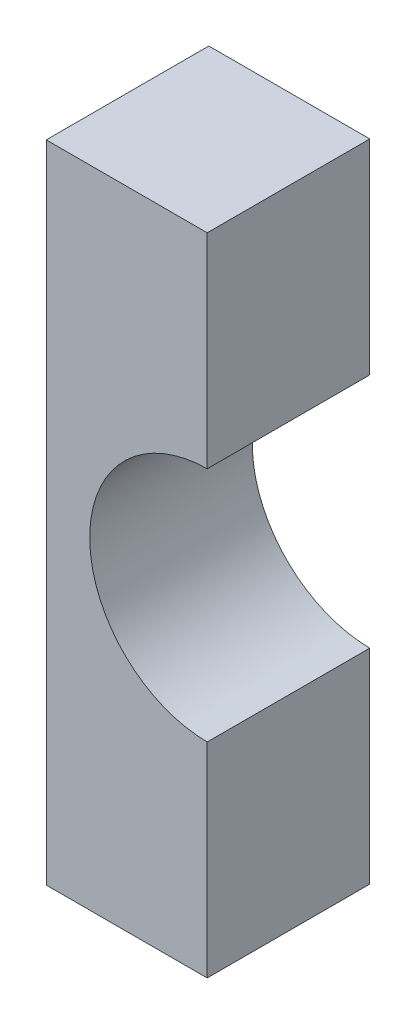
ISO-10303-21;
HEADER;
FILE_DESCRIPTION(('STEP AP214'),'2;1');
FILE_NAME('part.step','',(''),(''),'','','');
FILE_SCHEMA(('AUTOMOTIVE_DESIGN { 1 0 10303 214 1 1 1 1 }'));
ENDSEC;
DATA;
#1=APPLICATION_CONTEXT('core data for automotive mechanical design processes');
#2=APPLICATION_PROTOCOL_DEFINITION('international standard','automotive_design',2000,#1);
#3=PRODUCT_CONTEXT('',#1,'mechanical');
#4=PRODUCT('Part','Part','',(#3));
#5=PRODUCT_RELATED_PRODUCT_CATEGORY('part','',(#4));
#6=PRODUCT_DEFINITION_FORMATION('','',#4);
#7=PRODUCT_DEFINITION_CONTEXT('part definition',#1,'design');
#8=PRODUCT_DEFINITION('design','',#6,#7);
#9=PRODUCT_DEFINITION_SHAPE('','',#8);
#10=(LENGTH_UNIT() NAMED_UNIT(*) SI_UNIT(.MILLI.,.METRE.));
#11=(NAMED_UNIT(*) PLANE_ANGLE_UNIT() SI_UNIT($,.RADIAN.));
#12=(NAMED_UNIT(*) SI_UNIT($,.STERADIAN.) SOLID_ANGLE_UNIT());
#13=UNCERTAINTY_MEASURE_WITH_UNIT(LENGTH_MEASURE(1.E-05),#10,'distance_accuracy_value','');
#14=(GEOMETRIC_REPRESENTATION_CONTEXT(3) GLOBAL_UNCERTAINTY_ASSIGNED_CONTEXT((#13)) GLOBAL_UNIT_ASSIGNED_CONTEXT((#10,
#11,#12)) REPRESENTATION_CONTEXT('',''));
#15=CARTESIAN_POINT('',(0.,0.,0.));
#16=DIRECTION('',(0.,0.,1.));
#17=DIRECTION('',(1.,0.,0.));
#18=AXIS2_PLACEMENT_3D('',#15,#16,#17);
#19=CARTESIAN_POINT('',(0.799,0.401,0.201));
#20=DIRECTION('',(1.,0.,0.));
#21=DIRECTION('',(0.,0.,-1.));
#22=AXIS2_PLACEMENT_3D('',#19,#20,#21);
#23=PLANE('',#22);
#24=DIRECTION('',(0.,0.,-1.));
#25=VECTOR('',#24,1.);
#26=CARTESIAN_POINT('',(0.798999999999999,0.146996598600104,0.201));
#27=LINE('',#26,#25);
#28=CARTESIAN_POINT('',(0.799,0.146996598600104,0.201));
#29=VERTEX_POINT('',#28);
#30=CARTESIAN_POINT('',(0.799,0.146996598600104,-0.000999999999999997));
#31=VERTEX_POINT('',#30);
#32=EDGE_CURVE('E77',#29,#31,#27,.T.);
#33=ORIENTED_EDGE('',*,*,#32,.T.);
#34=DIRECTION('',(0.,1.,0.));
#35=VECTOR('',#34,1.);
#36=CARTESIAN_POINT('',(0.799,0.,-0.001));
#37=LINE('',#36,#35);
#38=CARTESIAN_POINT('',(0.799,0.401,-0.000999999999999999));
#39=VERTEX_POINT('',#38);
#40=EDGE_CURVE('E94',#39,#31,#37,.F.);
#41=ORIENTED_EDGE('',*,*,#40,.F.);
#42=DIRECTION('',(0.,0.,1.));
#43=VECTOR('',#42,1.);
#44=CARTESIAN_POINT('',(0.799,0.401,0.201));
#45=LINE('',#44,#43);
#46=CARTESIAN_POINT('',(0.799,0.401,0.201));
#47=VERTEX_POINT('',#46);
#48=EDGE_CURVE('E79',#47,#39,#45,.F.);
#49=ORIENTED_EDGE('',*,*,#48,.F.);
#50=DIRECTION('',(0.,1.,0.));
#51=VECTOR('',#50,1.);
#52=CARTESIAN_POINT('',(0.799,0.,0.201));
#53=LINE('',#52,#51);
#54=EDGE_CURVE('E70',#47,#29,#53,.F.);
#55=ORIENTED_EDGE('',*,*,#54,.T.);
#56=EDGE_LOOP('',(#33,#41,#49,#55));
#57=FACE_BOUND('',#56,.T.);
#58=ADVANCED_FACE('F17',(#57),#23,.T.);
#59=CARTESIAN_POINT('',(0.8,0.,0.201));
#60=DIRECTION('',(0.,0.,-1.));
#61=DIRECTION('',(-1.,0.,0.));
#62=AXIS2_PLACEMENT_3D('',#59,#60,#61);
#63=CYLINDRICAL_SURFACE('',#62,0.147);
#64=ORIENTED_EDGE('',*,*,#32,.F.);
#65=CARTESIAN_POINT('',(0.8,0.,0.201));
#66=DIRECTION('',(0.,0.,-1.));
#67=DIRECTION('',(-1.,0.,0.));
#68=AXIS2_PLACEMENT_3D('',#65,#66,#67);
#69=CIRCLE('',#68,0.147);
#70=CARTESIAN_POINT('',(0.799,-0.146996598600052,0.201));
#71=VERTEX_POINT('',#70);
#72=EDGE_CURVE('E20',#29,#71,#69,.F.);
#73=ORIENTED_EDGE('',*,*,#72,.T.);
#74=DIRECTION('',(0.,0.,-1.));
#75=VECTOR('',#74,1.);
#76=CARTESIAN_POINT('',(0.799,-0.1469965986,0.201));
#77=LINE('',#76,#75);
#78=CARTESIAN_POINT('',(0.799,-0.146996598600052,-0.000999999999999998));
#79=VERTEX_POINT('',#78);
#80=EDGE_CURVE('E86',#79,#71,#77,.F.);
#81=ORIENTED_EDGE('',*,*,#80,.F.);
#82=CARTESIAN_POINT('',(0.8,0.,-0.000999999999999997));
#83=DIRECTION('',(0.,0.,-1.));
#84=DIRECTION('',(-1.,0.,0.));
#85=AXIS2_PLACEMENT_3D('',#82,#83,#84);
#86=CIRCLE('',#85,0.147);
#87=EDGE_CURVE('E85',#31,#79,#86,.F.);
#88=ORIENTED_EDGE('',*,*,#87,.F.);
#89=EDGE_LOOP('',(#64,#73,#81,#88));
#90=FACE_BOUND('',#89,.T.);
#91=ADVANCED_FACE('F83',(#90),#63,.F.);
#92=CARTESIAN_POINT('',(0.799,-0.1469965986,0.201));
#93=DIRECTION('',(1.,0.,0.));
#94=DIRECTION('',(0.,0.,-1.));
#95=AXIS2_PLACEMENT_3D('',#92,#93,#94);
#96=PLANE('',#95);
#97=DIRECTION('',(0.,0.,-1.));
#98=VECTOR('',#97,1.);
#99=CARTESIAN_POINT('',(0.799,-0.401,0.201));
#100=LINE('',#99,#98);
#101=CARTESIAN_POINT('',(0.799,-0.401,-0.000999999999999999));
#102=VERTEX_POINT('',#101);
#103=CARTESIAN_POINT('',(0.799,-0.401,0.201));
#104=VERTEX_POINT('',#103);
#105=EDGE_CURVE('E81',#102,#104,#100,.F.);
#106=ORIENTED_EDGE('',*,*,#105,.F.);
#107=DIRECTION('',(0.,1.,0.));
#108=VECTOR('',#107,1.);
#109=CARTESIAN_POINT('',(0.799,0.,-0.001));
#110=LINE('',#109,#108);
#111=EDGE_CURVE('E120',#79,#102,#110,.F.);
#112=ORIENTED_EDGE('',*,*,#111,.F.);
#113=ORIENTED_EDGE('',*,*,#80,.T.);
#114=DIRECTION('',(0.,1.,0.));
#115=VECTOR('',#114,1.);
#116=CARTESIAN_POINT('',(0.799,0.,0.201));
#117=LINE('',#116,#115);
#118=EDGE_CURVE('E73',#71,#104,#117,.F.);
#119=ORIENTED_EDGE('',*,*,#118,.T.);
#120=EDGE_LOOP('',(#106,#112,#113,#119));
#121=FACE_BOUND('',#120,.T.);
#122=ADVANCED_FACE('F152',(#121),#96,.T.);
#123=CARTESIAN_POINT('',(0.799,-0.401,0.201));
#124=DIRECTION('',(0.,-1.,0.));
#125=DIRECTION('',(0.,0.,-1.));
#126=AXIS2_PLACEMENT_3D('',#123,#124,#125);
#127=PLANE('',#126);
#128=DIRECTION('',(0.,0.,1.));
#129=VECTOR('',#128,1.);
#130=CARTESIAN_POINT('',(0.599,-0.401,0.201));
#131=LINE('',#130,#129);
#132=CARTESIAN_POINT('',(0.599,-0.401,-0.000999999999999998));
#133=VERTEX_POINT('',#132);
#134=CARTESIAN_POINT('',(0.599,-0.401,0.201));
#135=VERTEX_POINT('',#134);
#136=EDGE_CURVE('E114',#133,#135,#131,.T.);
#137=ORIENTED_EDGE('',*,*,#136,.F.);
#138=DIRECTION('',(-1.,0.,0.));
#139=VECTOR('',#138,1.);
#140=CARTESIAN_POINT('',(0.8,-0.401,-0.001));
#141=LINE('',#140,#139);
#142=EDGE_CURVE('E123',#102,#133,#141,.T.);
#143=ORIENTED_EDGE('',*,*,#142,.F.);
#144=ORIENTED_EDGE('',*,*,#105,.T.);
#145=DIRECTION('',(-1.,0.,0.));
#146=VECTOR('',#145,1.);
#147=CARTESIAN_POINT('',(0.8,-0.401,0.201));
#148=LINE('',#147,#146);
#149=EDGE_CURVE('E109',#104,#135,#148,.T.);
#150=ORIENTED_EDGE('',*,*,#149,.T.);
#151=EDGE_LOOP('',(#137,#143,#144,#150));
#152=FACE_BOUND('',#151,.T.);
#153=ADVANCED_FACE('F143',(#152),#127,.T.);
#154=CARTESIAN_POINT('',(0.8,0.,0.201));
#155=DIRECTION('',(0.,0.,-1.));
#156=DIRECTION('',(-1.,0.,0.));
#157=AXIS2_PLACEMENT_3D('',#154,#155,#156);
#158=PLANE('',#157);
#159=ORIENTED_EDGE('',*,*,#118,.F.);
#160=ORIENTED_EDGE('',*,*,#72,.F.);
#161=ORIENTED_EDGE('',*,*,#54,.F.);
#162=DIRECTION('',(1.,0.,0.));
#163=VECTOR('',#162,1.);
#164=CARTESIAN_POINT('',(0.599,0.401,0.201));
#165=LINE('',#164,#163);
#166=CARTESIAN_POINT('',(0.599,0.401,0.201));
#167=VERTEX_POINT('',#166);
#168=EDGE_CURVE('E98',#167,#47,#165,.T.);
#169=ORIENTED_EDGE('',*,*,#168,.F.);
#170=DIRECTION('',(0.,1.,0.));
#171=VECTOR('',#170,1.);
#172=CARTESIAN_POINT('',(0.599,-0.401,0.201));
#173=LINE('',#172,#171);
#174=EDGE_CURVE('E105',#135,#167,#173,.T.);
#175=ORIENTED_EDGE('',*,*,#174,.F.);
#176=ORIENTED_EDGE('',*,*,#149,.F.);
#177=EDGE_LOOP('',(#159,#160,#161,#169,#175,#176));
#178=FACE_BOUND('',#177,.T.);
#179=ADVANCED_FACE('F69',(#178),#158,.F.);
#180=CARTESIAN_POINT('',(0.599,0.401,0.201));
#181=DIRECTION('',(0.,1.,0.));
#182=DIRECTION('',(0.,0.,1.));
#183=AXIS2_PLACEMENT_3D('',#180,#181,#182);
#184=PLANE('',#183);
#185=ORIENTED_EDGE('',*,*,#48,.T.);
#186=DIRECTION('',(-1.,0.,0.));
#187=VECTOR('',#186,1.);
#188=CARTESIAN_POINT('',(0.8,0.401,-0.001));
#189=LINE('',#188,#187);
#190=CARTESIAN_POINT('',(0.599,0.401,-0.001));
#191=VERTEX_POINT('',#190);
#192=EDGE_CURVE('E35',#191,#39,#189,.F.);
#193=ORIENTED_EDGE('',*,*,#192,.F.);
#194=DIRECTION('',(0.,0.,1.));
#195=VECTOR('',#194,1.);
#196=CARTESIAN_POINT('',(0.599,0.401,0.201));
#197=LINE('',#196,#195);
#198=EDGE_CURVE('E26',#167,#191,#197,.F.);
#199=ORIENTED_EDGE('',*,*,#198,.F.);
#200=ORIENTED_EDGE('',*,*,#168,.T.);
#201=EDGE_LOOP('',(#185,#193,#199,#200));
#202=FACE_BOUND('',#201,.T.);
#203=ADVANCED_FACE('F166',(#202),#184,.T.);
#204=CARTESIAN_POINT('',(0.8,0.,-0.001));
#205=DIRECTION('',(0.,0.,-1.));
#206=DIRECTION('',(-1.,0.,0.));
#207=AXIS2_PLACEMENT_3D('',#204,#205,#206);
#208=PLANE('',#207);
#209=ORIENTED_EDGE('',*,*,#142,.T.);
#210=DIRECTION('',(0.,1.,0.));
#211=VECTOR('',#210,1.);
#212=CARTESIAN_POINT('',(0.599,-0.401,-0.000999999999999997));
#213=LINE('',#212,#211);
#214=EDGE_CURVE('E11',#191,#133,#213,.F.);
#215=ORIENTED_EDGE('',*,*,#214,.F.);
#216=ORIENTED_EDGE('',*,*,#192,.T.);
#217=ORIENTED_EDGE('',*,*,#40,.T.);
#218=ORIENTED_EDGE('',*,*,#87,.T.);
#219=ORIENTED_EDGE('',*,*,#111,.T.);
#220=EDGE_LOOP('',(#209,#215,#216,#217,#218,#219));
#221=FACE_BOUND('',#220,.T.);
#222=ADVANCED_FACE('F151',(#221),#208,.T.);
#223=CARTESIAN_POINT('',(0.599,-0.401,0.201));
#224=DIRECTION('',(-1.,0.,0.));
#225=DIRECTION('',(0.,0.,1.));
#226=AXIS2_PLACEMENT_3D('',#223,#224,#225);
#227=PLANE('',#226);
#228=ORIENTED_EDGE('',*,*,#198,.T.);
#229=ORIENTED_EDGE('',*,*,#214,.T.);
#230=ORIENTED_EDGE('',*,*,#136,.T.);
#231=ORIENTED_EDGE('',*,*,#174,.T.);
#232=EDGE_LOOP('',(#228,#229,#230,#231));
#233=FACE_BOUND('',#232,.T.);
#234=ADVANCED_FACE('F149',(#233),#227,.T.);
#235=CLOSED_SHELL('',(#58,#91,#122,#153,#179,#203,#222,#234));
#236=MANIFOLD_SOLID_BREP('B1',#235);
#237=ADVANCED_BREP_SHAPE_REPRESENTATION('',(#18,#236),#14);
#238=SHAPE_DEFINITION_REPRESENTATION(#9,#237);
ENDSEC;
END-ISO-10303-21;
